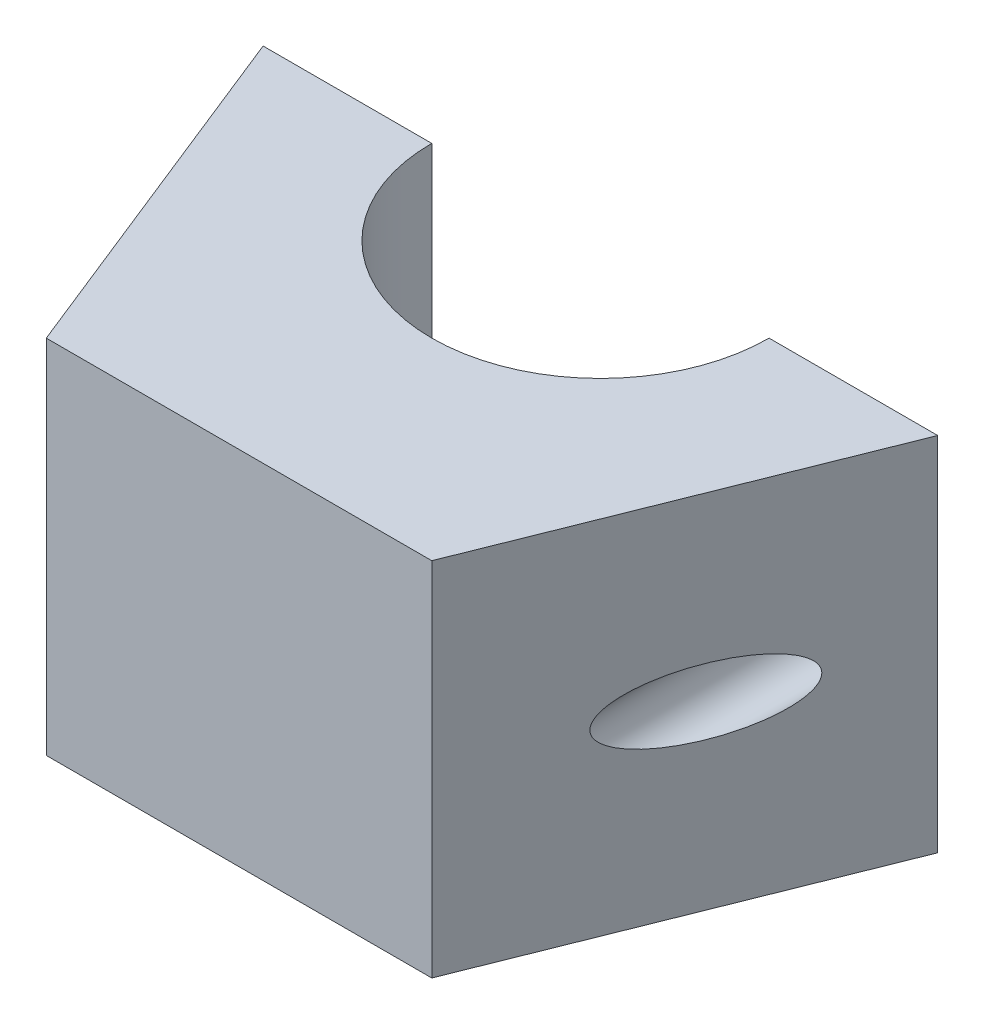
ISO-10303-21;
HEADER;
FILE_DESCRIPTION(('STEP AP214'),'2;1');
FILE_NAME('part.step','',(''),(''),'','','');
FILE_SCHEMA(('AUTOMOTIVE_DESIGN { 1 0 10303 214 1 1 1 1 }'));
ENDSEC;
DATA;
#1=APPLICATION_CONTEXT('core data for automotive mechanical design processes');
#2=APPLICATION_PROTOCOL_DEFINITION('international standard','automotive_design',2000,#1);
#3=PRODUCT_CONTEXT('',#1,'mechanical');
#4=PRODUCT('Part','Part','',(#3));
#5=PRODUCT_RELATED_PRODUCT_CATEGORY('part','',(#4));
#6=PRODUCT_DEFINITION_FORMATION('','',#4);
#7=PRODUCT_DEFINITION_CONTEXT('part definition',#1,'design');
#8=PRODUCT_DEFINITION('design','',#6,#7);
#9=PRODUCT_DEFINITION_SHAPE('','',#8);
#10=(LENGTH_UNIT() NAMED_UNIT(*) SI_UNIT(.MILLI.,.METRE.));
#11=(NAMED_UNIT(*) PLANE_ANGLE_UNIT() SI_UNIT($,.RADIAN.));
#12=(NAMED_UNIT(*) SI_UNIT($,.STERADIAN.) SOLID_ANGLE_UNIT());
#13=UNCERTAINTY_MEASURE_WITH_UNIT(LENGTH_MEASURE(1.E-05),#10,'distance_accuracy_value','');
#14=(GEOMETRIC_REPRESENTATION_CONTEXT(3) GLOBAL_UNCERTAINTY_ASSIGNED_CONTEXT((#13)) GLOBAL_UNIT_ASSIGNED_CONTEXT((#10,
#11,#12)) REPRESENTATION_CONTEXT('',''));
#15=CARTESIAN_POINT('',(0.,0.,0.));
#16=DIRECTION('',(0.,0.,1.));
#17=DIRECTION('',(1.,0.,0.));
#18=AXIS2_PLACEMENT_3D('',#15,#16,#17);
#19=CARTESIAN_POINT('',(-34.8161764705882,15.,11.9669117647059));
#20=DIRECTION('',(0.,0.,-1.));
#21=DIRECTION('',(-1.,0.,0.));
#22=AXIS2_PLACEMENT_3D('',#19,#20,#21);
#23=PLANE('',#22);
#24=DIRECTION('',(1.,0.,0.));
#25=VECTOR('',#24,1.);
#26=CARTESIAN_POINT('',(-34.8161764705882,0.,11.9669117647059));
#27=LINE('',#26,#25);
#28=CARTESIAN_POINT('',(-22.8161764705882,0.,11.9669117647059));
#29=VERTEX_POINT('',#28);
#30=CARTESIAN_POINT('',(-6.81617647058824,0.,11.9669117647059));
#31=VERTEX_POINT('',#30);
#32=EDGE_CURVE('E42',#29,#31,#27,.T.);
#33=ORIENTED_EDGE('',*,*,#32,.T.);
#34=DIRECTION('',(0.,1.,0.));
#35=VECTOR('',#34,1.);
#36=CARTESIAN_POINT('',(-6.81617647058824,0.,11.9669117647059));
#37=LINE('',#36,#35);
#38=CARTESIAN_POINT('',(-6.81617647058824,15.,11.9669117647059));
#39=VERTEX_POINT('',#38);
#40=EDGE_CURVE('E59',#31,#39,#37,.T.);
#41=ORIENTED_EDGE('',*,*,#40,.T.);
#42=DIRECTION('',(1.,0.,0.));
#43=VECTOR('',#42,1.);
#44=CARTESIAN_POINT('',(-34.8161764705882,15.,11.9669117647059));
#45=LINE('',#44,#43);
#46=CARTESIAN_POINT('',(-22.8161764705882,15.,11.9669117647059));
#47=VERTEX_POINT('',#46);
#48=EDGE_CURVE('E11',#47,#39,#45,.T.);
#49=ORIENTED_EDGE('',*,*,#48,.F.);
#50=DIRECTION('',(0.,1.,0.));
#51=VECTOR('',#50,1.);
#52=CARTESIAN_POINT('',(-22.8161764705882,0.,11.9669117647059));
#53=LINE('',#52,#51);
#54=EDGE_CURVE('E120',#29,#47,#53,.T.);
#55=ORIENTED_EDGE('',*,*,#54,.F.);
#56=EDGE_LOOP('',(#33,#41,#49,#55));
#57=FACE_BOUND('',#56,.T.);
#58=ADVANCED_FACE('F34',(#57),#23,.F.);
#59=CARTESIAN_POINT('',(0.,15.,0.));
#60=DIRECTION('',(0.,1.,0.));
#61=DIRECTION('',(0.,0.,1.));
#62=AXIS2_PLACEMENT_3D('',#59,#60,#61);
#63=PLANE('',#62);
#64=DIRECTION('',(-0.371390676354104,0.,0.928476690885259));
#65=VECTOR('',#64,1.);
#66=CARTESIAN_POINT('',(-1.74949290060852,15.,-0.699797160243408));
#67=LINE('',#66,#65);
#68=CARTESIAN_POINT('',(-0.816176470588239,15.,-3.03308823529411));
#69=VERTEX_POINT('',#68);
#70=EDGE_CURVE('E82',#69,#39,#67,.T.);
#71=ORIENTED_EDGE('',*,*,#70,.F.);
#72=DIRECTION('',(1.,0.,0.));
#73=VECTOR('',#72,1.);
#74=CARTESIAN_POINT('',(0.,15.,-3.03308823529411));
#75=LINE('',#74,#73);
#76=CARTESIAN_POINT('',(-7.81617647058824,15.,-3.03308823529411));
#77=VERTEX_POINT('',#76);
#78=EDGE_CURVE('E129',#77,#69,#75,.T.);
#79=ORIENTED_EDGE('',*,*,#78,.F.);
#80=CARTESIAN_POINT('',(-14.8161764705882,15.,-3.03308823529411));
#81=DIRECTION('',(0.,1.,0.));
#82=DIRECTION('',(0.,0.,1.));
#83=AXIS2_PLACEMENT_3D('',#80,#81,#82);
#84=CIRCLE('',#83,7.);
#85=CARTESIAN_POINT('',(-21.8161764705882,15.,-3.03308823529411));
#86=VERTEX_POINT('',#85);
#87=EDGE_CURVE('E101',#86,#77,#84,.T.);
#88=ORIENTED_EDGE('',*,*,#87,.F.);
#89=DIRECTION('',(1.,0.,0.));
#90=VECTOR('',#89,1.);
#91=CARTESIAN_POINT('',(0.,15.,-3.03308823529411));
#92=LINE('',#91,#90);
#93=CARTESIAN_POINT('',(-28.8161764705882,15.,-3.0330882352941));
#94=VERTEX_POINT('',#93);
#95=EDGE_CURVE('E124',#94,#86,#92,.T.);
#96=ORIENTED_EDGE('',*,*,#95,.F.);
#97=DIRECTION('',(0.371390676354104,0.,0.928476690885259));
#98=VECTOR('',#97,1.);
#99=CARTESIAN_POINT('',(-23.7956389452333,15.,9.51825557809331));
#100=LINE('',#99,#98);
#101=EDGE_CURVE('E121',#94,#47,#100,.T.);
#102=ORIENTED_EDGE('',*,*,#101,.T.);
#103=ORIENTED_EDGE('',*,*,#48,.T.);
#104=EDGE_LOOP('',(#71,#79,#88,#96,#102,#103));
#105=FACE_BOUND('',#104,.T.);
#106=ADVANCED_FACE('F143',(#105),#63,.T.);
#107=CARTESIAN_POINT('',(0.,0.,0.));
#108=DIRECTION('',(0.,1.,0.));
#109=DIRECTION('',(0.,0.,1.));
#110=AXIS2_PLACEMENT_3D('',#107,#108,#109);
#111=PLANE('',#110);
#112=DIRECTION('',(1.,0.,0.));
#113=VECTOR('',#112,1.);
#114=CARTESIAN_POINT('',(0.,0.,-3.03308823529411));
#115=LINE('',#114,#113);
#116=CARTESIAN_POINT('',(-7.81617647058824,0.,-3.03308823529411));
#117=VERTEX_POINT('',#116);
#118=CARTESIAN_POINT('',(-0.816176470588239,0.,-3.03308823529411));
#119=VERTEX_POINT('',#118);
#120=EDGE_CURVE('E109',#117,#119,#115,.T.);
#121=ORIENTED_EDGE('',*,*,#120,.T.);
#122=DIRECTION('',(-0.371390676354104,0.,0.928476690885259));
#123=VECTOR('',#122,1.);
#124=CARTESIAN_POINT('',(-1.74949290060852,0.,-0.699797160243408));
#125=LINE('',#124,#123);
#126=EDGE_CURVE('E112',#119,#31,#125,.T.);
#127=ORIENTED_EDGE('',*,*,#126,.T.);
#128=ORIENTED_EDGE('',*,*,#32,.F.);
#129=DIRECTION('',(0.371390676354104,0.,0.928476690885259));
#130=VECTOR('',#129,1.);
#131=CARTESIAN_POINT('',(-23.7956389452333,0.,9.51825557809331));
#132=LINE('',#131,#130);
#133=CARTESIAN_POINT('',(-28.8161764705882,0.,-3.0330882352941));
#134=VERTEX_POINT('',#133);
#135=EDGE_CURVE('E88',#134,#29,#132,.T.);
#136=ORIENTED_EDGE('',*,*,#135,.F.);
#137=DIRECTION('',(1.,0.,0.));
#138=VECTOR('',#137,1.);
#139=CARTESIAN_POINT('',(0.,0.,-3.03308823529411));
#140=LINE('',#139,#138);
#141=CARTESIAN_POINT('',(-21.8161764705882,0.,-3.03308823529411));
#142=VERTEX_POINT('',#141);
#143=EDGE_CURVE('E50',#134,#142,#140,.T.);
#144=ORIENTED_EDGE('',*,*,#143,.T.);
#145=CARTESIAN_POINT('',(-14.8161764705882,0.,-3.03308823529411));
#146=DIRECTION('',(0.,1.,0.));
#147=DIRECTION('',(0.,0.,1.));
#148=AXIS2_PLACEMENT_3D('',#145,#146,#147);
#149=CIRCLE('',#148,7.);
#150=EDGE_CURVE('E99',#142,#117,#149,.T.);
#151=ORIENTED_EDGE('',*,*,#150,.T.);
#152=EDGE_LOOP('',(#121,#127,#128,#136,#144,#151));
#153=FACE_BOUND('',#152,.T.);
#154=ADVANCED_FACE('F114',(#153),#111,.F.);
#155=CARTESIAN_POINT('',(-1.74949290060852,0.,-0.699797160243408));
#156=DIRECTION('',(-0.928476690885259,0.,-0.371390676354104));
#157=DIRECTION('',(-0.371390676354104,0.,0.928476690885259));
#158=AXIS2_PLACEMENT_3D('',#155,#156,#157);
#159=PLANE('',#158);
#160=CARTESIAN_POINT('',(-3.56617647058824,7.5,3.84191176470588));
#161=DIRECTION('',(-0.928476690885259,0.,-0.371390676354104));
#162=DIRECTION('',(0.371390676354104,0.,-0.928476690885259));
#163=AXIS2_PLACEMENT_3D('',#160,#161,#162);
#164=ELLIPSE('',#163,3.70230080490497,1.375);
#165=CARTESIAN_POINT('',(-2.19117647058824,7.5,0.404411764705888));
#166=VERTEX_POINT('',#165);
#167=EDGE_CURVE('E125',#166,#166,#164,.T.);
#168=ORIENTED_EDGE('',*,*,#167,.T.);
#169=EDGE_LOOP('',(#168));
#170=FACE_BOUND('',#169,.T.);
#171=ORIENTED_EDGE('',*,*,#70,.T.);
#172=ORIENTED_EDGE('',*,*,#40,.F.);
#173=ORIENTED_EDGE('',*,*,#126,.F.);
#174=DIRECTION('',(0.,1.,0.));
#175=VECTOR('',#174,1.);
#176=CARTESIAN_POINT('',(-0.816176470588239,0.,-3.03308823529411));
#177=LINE('',#176,#175);
#178=EDGE_CURVE('E105',#119,#69,#177,.T.);
#179=ORIENTED_EDGE('',*,*,#178,.T.);
#180=EDGE_LOOP('',(#171,#172,#173,#179));
#181=FACE_BOUND('',#180,.T.);
#182=ADVANCED_FACE('F141',(#170,#181),#159,.F.);
#183=CARTESIAN_POINT('',(0.,0.,-3.03308823529411));
#184=DIRECTION('',(0.,0.,1.));
#185=DIRECTION('',(1.,0.,0.));
#186=AXIS2_PLACEMENT_3D('',#183,#184,#185);
#187=PLANE('',#186);
#188=CARTESIAN_POINT('',(-3.56617647058824,7.5,-3.03308823529411));
#189=DIRECTION('',(0.,0.,-1.));
#190=DIRECTION('',(-1.,0.,0.));
#191=AXIS2_PLACEMENT_3D('',#188,#189,#190);
#192=CIRCLE('',#191,1.375);
#193=CARTESIAN_POINT('',(-4.94117647058824,7.5,-3.03308823529411));
#194=VERTEX_POINT('',#193);
#195=EDGE_CURVE('E191',#194,#194,#192,.T.);
#196=ORIENTED_EDGE('',*,*,#195,.F.);
#197=EDGE_LOOP('',(#196));
#198=FACE_BOUND('',#197,.T.);
#199=ORIENTED_EDGE('',*,*,#78,.T.);
#200=ORIENTED_EDGE('',*,*,#178,.F.);
#201=ORIENTED_EDGE('',*,*,#120,.F.);
#202=DIRECTION('',(0.,1.,0.));
#203=VECTOR('',#202,1.);
#204=CARTESIAN_POINT('',(-7.81617647058824,0.,-3.03308823529411));
#205=LINE('',#204,#203);
#206=EDGE_CURVE('E95',#117,#77,#205,.T.);
#207=ORIENTED_EDGE('',*,*,#206,.T.);
#208=EDGE_LOOP('',(#199,#200,#201,#207));
#209=FACE_BOUND('',#208,.T.);
#210=ADVANCED_FACE('F110',(#198,#209),#187,.F.);
#211=CARTESIAN_POINT('',(-14.8161764705882,0.,-3.03308823529411));
#212=DIRECTION('',(0.,1.,0.));
#213=DIRECTION('',(0.,0.,1.));
#214=AXIS2_PLACEMENT_3D('',#211,#212,#213);
#215=CYLINDRICAL_SURFACE('',#214,7.);
#216=ORIENTED_EDGE('',*,*,#87,.T.);
#217=ORIENTED_EDGE('',*,*,#206,.F.);
#218=ORIENTED_EDGE('',*,*,#150,.F.);
#219=DIRECTION('',(0.,1.,0.));
#220=VECTOR('',#219,1.);
#221=CARTESIAN_POINT('',(-21.8161764705882,0.,-3.03308823529411));
#222=LINE('',#221,#220);
#223=EDGE_CURVE('E106',#142,#86,#222,.T.);
#224=ORIENTED_EDGE('',*,*,#223,.T.);
#225=EDGE_LOOP('',(#216,#217,#218,#224));
#226=FACE_BOUND('',#225,.T.);
#227=ADVANCED_FACE('F97',(#226),#215,.F.);
#228=CARTESIAN_POINT('',(0.,0.,-3.03308823529411));
#229=DIRECTION('',(0.,0.,1.));
#230=DIRECTION('',(1.,0.,0.));
#231=AXIS2_PLACEMENT_3D('',#228,#229,#230);
#232=PLANE('',#231);
#233=CARTESIAN_POINT('',(-26.0661764705882,7.5,-3.03308823529411));
#234=DIRECTION('',(0.,0.,1.));
#235=DIRECTION('',(1.,0.,0.));
#236=AXIS2_PLACEMENT_3D('',#233,#234,#235);
#237=CIRCLE('',#236,1.375);
#238=CARTESIAN_POINT('',(-24.6911764705882,7.5,-3.03308823529411));
#239=VERTEX_POINT('',#238);
#240=EDGE_CURVE('E196',#239,#239,#237,.T.);
#241=ORIENTED_EDGE('',*,*,#240,.T.);
#242=EDGE_LOOP('',(#241));
#243=FACE_BOUND('',#242,.T.);
#244=ORIENTED_EDGE('',*,*,#95,.T.);
#245=ORIENTED_EDGE('',*,*,#223,.F.);
#246=ORIENTED_EDGE('',*,*,#143,.F.);
#247=DIRECTION('',(0.,1.,0.));
#248=VECTOR('',#247,1.);
#249=CARTESIAN_POINT('',(-28.8161764705882,0.,-3.0330882352941));
#250=LINE('',#249,#248);
#251=EDGE_CURVE('E135',#134,#94,#250,.T.);
#252=ORIENTED_EDGE('',*,*,#251,.T.);
#253=EDGE_LOOP('',(#244,#245,#246,#252));
#254=FACE_BOUND('',#253,.T.);
#255=ADVANCED_FACE('F147',(#243,#254),#232,.F.);
#256=CARTESIAN_POINT('',(-23.7956389452333,0.,9.51825557809331));
#257=DIRECTION('',(-0.928476690885259,0.,0.371390676354104));
#258=DIRECTION('',(0.371390676354104,0.,0.928476690885259));
#259=AXIS2_PLACEMENT_3D('',#256,#257,#258);
#260=PLANE('',#259);
#261=CARTESIAN_POINT('',(-26.0661764705882,7.5,3.8419117647059));
#262=DIRECTION('',(-0.928476690885259,0.,0.371390676354104));
#263=DIRECTION('',(-0.371390676354104,0.,-0.928476690885259));
#264=AXIS2_PLACEMENT_3D('',#261,#262,#263);
#265=ELLIPSE('',#264,3.70230080490498,1.375);
#266=CARTESIAN_POINT('',(-27.4411764705882,7.5,0.404411764705898));
#267=VERTEX_POINT('',#266);
#268=EDGE_CURVE('E37',#267,#267,#265,.F.);
#269=ORIENTED_EDGE('',*,*,#268,.T.);
#270=EDGE_LOOP('',(#269));
#271=FACE_BOUND('',#270,.T.);
#272=ORIENTED_EDGE('',*,*,#101,.F.);
#273=ORIENTED_EDGE('',*,*,#251,.F.);
#274=ORIENTED_EDGE('',*,*,#135,.T.);
#275=ORIENTED_EDGE('',*,*,#54,.T.);
#276=EDGE_LOOP('',(#272,#273,#274,#275));
#277=FACE_BOUND('',#276,.T.);
#278=ADVANCED_FACE('F146',(#271,#277),#260,.T.);
#279=CARTESIAN_POINT('',(-26.0661764705882,7.5,11.9669117647059));
#280=DIRECTION('',(0.,0.,-1.));
#281=DIRECTION('',(-1.,0.,0.));
#282=AXIS2_PLACEMENT_3D('',#279,#280,#281);
#283=CYLINDRICAL_SURFACE('',#282,1.375);
#284=ORIENTED_EDGE('',*,*,#268,.F.);
#285=EDGE_LOOP('',(#284));
#286=FACE_BOUND('',#285,.T.);
#287=ORIENTED_EDGE('',*,*,#240,.F.);
#288=EDGE_LOOP('',(#287));
#289=FACE_BOUND('',#288,.T.);
#290=ADVANCED_FACE('F155',(#286,#289),#283,.F.);
#291=CARTESIAN_POINT('',(-3.56617647058824,7.5,11.9669117647059));
#292=DIRECTION('',(0.,0.,-1.));
#293=DIRECTION('',(-1.,0.,0.));
#294=AXIS2_PLACEMENT_3D('',#291,#292,#293);
#295=CYLINDRICAL_SURFACE('',#294,1.375);
#296=ORIENTED_EDGE('',*,*,#195,.T.);
#297=EDGE_LOOP('',(#296));
#298=FACE_BOUND('',#297,.T.);
#299=ORIENTED_EDGE('',*,*,#167,.F.);
#300=EDGE_LOOP('',(#299));
#301=FACE_BOUND('',#300,.T.);
#302=ADVANCED_FACE('F182',(#298,#301),#295,.F.);
#303=CLOSED_SHELL('',(#58,#106,#154,#182,#210,#227,#255,#278,#290,#302));
#304=MANIFOLD_SOLID_BREP('B2',#303);
#305=ADVANCED_BREP_SHAPE_REPRESENTATION('',(#18,#304),#14);
#306=SHAPE_DEFINITION_REPRESENTATION(#9,#305);
ENDSEC;
END-ISO-10303-21;
